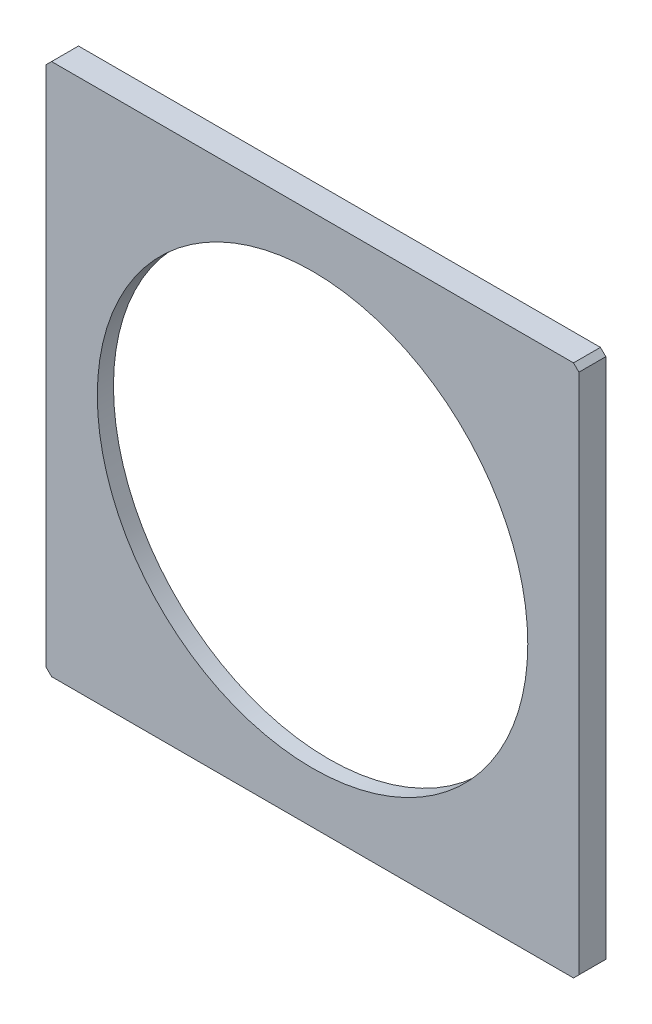
ISO-10303-21;
HEADER;
FILE_DESCRIPTION(('STEP AP214'),'2;1');
FILE_NAME('part.step','',(''),(''),'','','');
FILE_SCHEMA(('AUTOMOTIVE_DESIGN { 1 0 10303 214 1 1 1 1 }'));
ENDSEC;
DATA;
#1=APPLICATION_CONTEXT('core data for automotive mechanical design processes');
#2=APPLICATION_PROTOCOL_DEFINITION('international standard','automotive_design',2000,#1);
#3=PRODUCT_CONTEXT('',#1,'mechanical');
#4=PRODUCT('Part','Part','',(#3));
#5=PRODUCT_RELATED_PRODUCT_CATEGORY('part','',(#4));
#6=PRODUCT_DEFINITION_FORMATION('','',#4);
#7=PRODUCT_DEFINITION_CONTEXT('part definition',#1,'design');
#8=PRODUCT_DEFINITION('design','',#6,#7);
#9=PRODUCT_DEFINITION_SHAPE('','',#8);
#10=(LENGTH_UNIT() NAMED_UNIT(*) SI_UNIT(.MILLI.,.METRE.));
#11=(NAMED_UNIT(*) PLANE_ANGLE_UNIT() SI_UNIT($,.RADIAN.));
#12=(NAMED_UNIT(*) SI_UNIT($,.STERADIAN.) SOLID_ANGLE_UNIT());
#13=UNCERTAINTY_MEASURE_WITH_UNIT(LENGTH_MEASURE(1.E-05),#10,'distance_accuracy_value','');
#14=(GEOMETRIC_REPRESENTATION_CONTEXT(3) GLOBAL_UNCERTAINTY_ASSIGNED_CONTEXT((#13)) GLOBAL_UNIT_ASSIGNED_CONTEXT((#10,
#11,#12)) REPRESENTATION_CONTEXT('',''));
#15=CARTESIAN_POINT('',(0.,0.,0.));
#16=DIRECTION('',(0.,0.,1.));
#17=DIRECTION('',(1.,0.,0.));
#18=AXIS2_PLACEMENT_3D('',#15,#16,#17);
#19=CARTESIAN_POINT('',(0.,0.,0.));
#20=DIRECTION('',(0.,0.,1.));
#21=DIRECTION('',(1.,0.,0.));
#22=AXIS2_PLACEMENT_3D('',#19,#20,#21);
#23=PLANE('',#22);
#24=DIRECTION('',(0.,-1.,0.));
#25=VECTOR('',#24,1.);
#26=CARTESIAN_POINT('',(-49.5,49.5,0.));
#27=LINE('',#26,#25);
#28=CARTESIAN_POINT('',(-49.5,48.5,0.));
#29=VERTEX_POINT('',#28);
#30=CARTESIAN_POINT('',(-49.5,-48.5,0.));
#31=VERTEX_POINT('',#30);
#32=EDGE_CURVE('E145',#29,#31,#27,.T.);
#33=ORIENTED_EDGE('',*,*,#32,.F.);
#34=DIRECTION('',(-0.707106781186552,-0.707106781186543,0.));
#35=VECTOR('',#34,1.);
#36=CARTESIAN_POINT('',(-49.5,48.5,0.));
#37=LINE('',#36,#35);
#38=CARTESIAN_POINT('',(-48.5,49.5,0.));
#39=VERTEX_POINT('',#38);
#40=EDGE_CURVE('E130',#29,#39,#37,.F.);
#41=ORIENTED_EDGE('',*,*,#40,.T.);
#42=DIRECTION('',(-1.,0.,0.));
#43=VECTOR('',#42,1.);
#44=CARTESIAN_POINT('',(49.5,49.5,0.));
#45=LINE('',#44,#43);
#46=CARTESIAN_POINT('',(48.5,49.5,0.));
#47=VERTEX_POINT('',#46);
#48=EDGE_CURVE('E154',#47,#39,#45,.T.);
#49=ORIENTED_EDGE('',*,*,#48,.F.);
#50=DIRECTION('',(-0.707106781186548,0.707106781186548,0.));
#51=VECTOR('',#50,1.);
#52=CARTESIAN_POINT('',(48.5,49.5,0.));
#53=LINE('',#52,#51);
#54=CARTESIAN_POINT('',(49.5,48.5,0.));
#55=VERTEX_POINT('',#54);
#56=EDGE_CURVE('E138',#47,#55,#53,.F.);
#57=ORIENTED_EDGE('',*,*,#56,.T.);
#58=DIRECTION('',(0.,1.,0.));
#59=VECTOR('',#58,1.);
#60=CARTESIAN_POINT('',(49.5,49.5,0.));
#61=LINE('',#60,#59);
#62=CARTESIAN_POINT('',(49.5,-48.5,0.));
#63=VERTEX_POINT('',#62);
#64=EDGE_CURVE('E162',#63,#55,#61,.T.);
#65=ORIENTED_EDGE('',*,*,#64,.F.);
#66=DIRECTION('',(0.707106781186552,0.707106781186543,0.));
#67=VECTOR('',#66,1.);
#68=CARTESIAN_POINT('',(49.5,-48.5,0.));
#69=LINE('',#68,#67);
#70=CARTESIAN_POINT('',(48.5,-49.5,0.));
#71=VERTEX_POINT('',#70);
#72=EDGE_CURVE('E255',#63,#71,#69,.F.);
#73=ORIENTED_EDGE('',*,*,#72,.T.);
#74=DIRECTION('',(1.,0.,0.));
#75=VECTOR('',#74,1.);
#76=CARTESIAN_POINT('',(49.5,-49.5,0.));
#77=LINE('',#76,#75);
#78=CARTESIAN_POINT('',(-48.5,-49.5,0.));
#79=VERTEX_POINT('',#78);
#80=EDGE_CURVE('E253',#79,#71,#77,.T.);
#81=ORIENTED_EDGE('',*,*,#80,.F.);
#82=DIRECTION('',(0.707106781186548,-0.707106781186548,0.));
#83=VECTOR('',#82,1.);
#84=CARTESIAN_POINT('',(-48.5,-49.5,0.));
#85=LINE('',#84,#83);
#86=EDGE_CURVE('E146',#79,#31,#85,.F.);
#87=ORIENTED_EDGE('',*,*,#86,.T.);
#88=EDGE_LOOP('',(#33,#41,#49,#57,#65,#73,#81,#87));
#89=FACE_BOUND('',#88,.T.);
#90=CARTESIAN_POINT('',(0.,0.,-1.2E-05));
#91=DIRECTION('',(0.,0.,-1.));
#92=DIRECTION('',(-1.,0.,0.));
#93=AXIS2_PLACEMENT_3D('',#90,#91,#92);
#94=CIRCLE('',#93,43.);
#95=CARTESIAN_POINT('',(-43.,0.,-1.2E-05));
#96=VERTEX_POINT('',#95);
#97=EDGE_CURVE('E175',#96,#96,#94,.T.);
#98=ORIENTED_EDGE('',*,*,#97,.F.);
#99=EDGE_LOOP('',(#98));
#100=FACE_BOUND('',#99,.T.);
#101=ADVANCED_FACE('F50',(#89,#100),#23,.F.);
#102=CARTESIAN_POINT('',(0.,0.,5.));
#103=DIRECTION('',(0.,0.,-1.));
#104=DIRECTION('',(-1.,0.,0.));
#105=AXIS2_PLACEMENT_3D('',#102,#103,#104);
#106=CYLINDRICAL_SURFACE('',#105,40.);
#107=CARTESIAN_POINT('',(0.,0.,5.));
#108=DIRECTION('',(0.,0.,1.));
#109=DIRECTION('',(1.,0.,0.));
#110=AXIS2_PLACEMENT_3D('',#107,#108,#109);
#111=CIRCLE('',#110,40.);
#112=CARTESIAN_POINT('',(40.,0.,5.));
#113=VERTEX_POINT('',#112);
#114=EDGE_CURVE('E171',#113,#113,#111,.T.);
#115=ORIENTED_EDGE('',*,*,#114,.T.);
#116=EDGE_LOOP('',(#115));
#117=FACE_BOUND('',#116,.T.);
#118=CARTESIAN_POINT('',(0.,0.,2.));
#119=DIRECTION('',(0.,0.,-1.));
#120=DIRECTION('',(-1.,0.,0.));
#121=AXIS2_PLACEMENT_3D('',#118,#119,#120);
#122=CIRCLE('',#121,40.);
#123=CARTESIAN_POINT('',(-40.,0.,2.));
#124=VERTEX_POINT('',#123);
#125=EDGE_CURVE('E170',#124,#124,#122,.T.);
#126=ORIENTED_EDGE('',*,*,#125,.T.);
#127=EDGE_LOOP('',(#126));
#128=FACE_BOUND('',#127,.T.);
#129=ADVANCED_FACE('F188',(#117,#128),#106,.F.);
#130=CARTESIAN_POINT('',(0.,0.,5.));
#131=DIRECTION('',(0.,0.,1.));
#132=DIRECTION('',(1.,0.,0.));
#133=AXIS2_PLACEMENT_3D('',#130,#131,#132);
#134=PLANE('',#133);
#135=DIRECTION('',(-1.,0.,0.));
#136=VECTOR('',#135,1.);
#137=CARTESIAN_POINT('',(49.5,49.5,5.));
#138=LINE('',#137,#136);
#139=CARTESIAN_POINT('',(48.5,49.5,5.));
#140=VERTEX_POINT('',#139);
#141=CARTESIAN_POINT('',(-48.5,49.5,5.));
#142=VERTEX_POINT('',#141);
#143=EDGE_CURVE('E263',#140,#142,#138,.T.);
#144=ORIENTED_EDGE('',*,*,#143,.T.);
#145=DIRECTION('',(0.707106781186552,0.707106781186543,0.));
#146=VECTOR('',#145,1.);
#147=CARTESIAN_POINT('',(-48.9999999999997,49.0000000000003,5.));
#148=LINE('',#147,#146);
#149=CARTESIAN_POINT('',(-49.5,48.5,5.));
#150=VERTEX_POINT('',#149);
#151=EDGE_CURVE('E236',#142,#150,#148,.F.);
#152=ORIENTED_EDGE('',*,*,#151,.T.);
#153=DIRECTION('',(0.,-1.,0.));
#154=VECTOR('',#153,1.);
#155=CARTESIAN_POINT('',(-49.5,49.5,5.));
#156=LINE('',#155,#154);
#157=CARTESIAN_POINT('',(-49.5,-48.5,5.));
#158=VERTEX_POINT('',#157);
#159=EDGE_CURVE('E150',#150,#158,#156,.T.);
#160=ORIENTED_EDGE('',*,*,#159,.T.);
#161=DIRECTION('',(-0.707106781186548,0.707106781186548,0.));
#162=VECTOR('',#161,1.);
#163=CARTESIAN_POINT('',(-49.,-49.,5.));
#164=LINE('',#163,#162);
#165=CARTESIAN_POINT('',(-48.5,-49.5,5.));
#166=VERTEX_POINT('',#165);
#167=EDGE_CURVE('E234',#158,#166,#164,.F.);
#168=ORIENTED_EDGE('',*,*,#167,.T.);
#169=DIRECTION('',(1.,0.,0.));
#170=VECTOR('',#169,1.);
#171=CARTESIAN_POINT('',(49.5,-49.5,5.));
#172=LINE('',#171,#170);
#173=CARTESIAN_POINT('',(48.5,-49.5,5.));
#174=VERTEX_POINT('',#173);
#175=EDGE_CURVE('E152',#166,#174,#172,.T.);
#176=ORIENTED_EDGE('',*,*,#175,.T.);
#177=DIRECTION('',(-0.707106781186552,-0.707106781186543,0.));
#178=VECTOR('',#177,1.);
#179=CARTESIAN_POINT('',(48.9999999999996,-49.0000000000003,5.));
#180=LINE('',#179,#178);
#181=CARTESIAN_POINT('',(49.5,-48.5,5.));
#182=VERTEX_POINT('',#181);
#183=EDGE_CURVE('E76',#174,#182,#180,.F.);
#184=ORIENTED_EDGE('',*,*,#183,.T.);
#185=DIRECTION('',(0.,1.,0.));
#186=VECTOR('',#185,1.);
#187=CARTESIAN_POINT('',(49.5,49.5,5.));
#188=LINE('',#187,#186);
#189=CARTESIAN_POINT('',(49.5,48.5,5.));
#190=VERTEX_POINT('',#189);
#191=EDGE_CURVE('E159',#182,#190,#188,.T.);
#192=ORIENTED_EDGE('',*,*,#191,.T.);
#193=DIRECTION('',(0.707106781186548,-0.707106781186548,0.));
#194=VECTOR('',#193,1.);
#195=CARTESIAN_POINT('',(49.,49.,5.));
#196=LINE('',#195,#194);
#197=EDGE_CURVE('E233',#190,#140,#196,.F.);
#198=ORIENTED_EDGE('',*,*,#197,.T.);
#199=EDGE_LOOP('',(#144,#152,#160,#168,#176,#184,#192,#198));
#200=FACE_BOUND('',#199,.T.);
#201=ORIENTED_EDGE('',*,*,#114,.F.);
#202=EDGE_LOOP('',(#201));
#203=FACE_BOUND('',#202,.T.);
#204=ADVANCED_FACE('F189',(#200,#203),#134,.T.);
#205=CARTESIAN_POINT('',(49.5,-49.5,5.));
#206=DIRECTION('',(0.,1.,0.));
#207=DIRECTION('',(0.,0.,1.));
#208=AXIS2_PLACEMENT_3D('',#205,#206,#207);
#209=PLANE('',#208);
#210=ORIENTED_EDGE('',*,*,#80,.T.);
#211=DIRECTION('',(0.,0.,1.));
#212=VECTOR('',#211,1.);
#213=CARTESIAN_POINT('',(48.5,-49.5,5.));
#214=LINE('',#213,#212);
#215=EDGE_CURVE('E11',#71,#174,#214,.T.);
#216=ORIENTED_EDGE('',*,*,#215,.T.);
#217=ORIENTED_EDGE('',*,*,#175,.F.);
#218=DIRECTION('',(0.,0.,-1.));
#219=VECTOR('',#218,1.);
#220=CARTESIAN_POINT('',(-48.5,-49.5,5.));
#221=LINE('',#220,#219);
#222=EDGE_CURVE('E60',#166,#79,#221,.T.);
#223=ORIENTED_EDGE('',*,*,#222,.T.);
#224=EDGE_LOOP('',(#210,#216,#217,#223));
#225=FACE_BOUND('',#224,.T.);
#226=ADVANCED_FACE('F205',(#225),#209,.F.);
#227=CARTESIAN_POINT('',(49.5,49.5,5.));
#228=DIRECTION('',(-1.,0.,0.));
#229=DIRECTION('',(0.,-1.,0.));
#230=AXIS2_PLACEMENT_3D('',#227,#228,#229);
#231=PLANE('',#230);
#232=ORIENTED_EDGE('',*,*,#64,.T.);
#233=DIRECTION('',(0.,0.,1.));
#234=VECTOR('',#233,1.);
#235=CARTESIAN_POINT('',(49.5,48.5,5.));
#236=LINE('',#235,#234);
#237=EDGE_CURVE('E70',#55,#190,#236,.T.);
#238=ORIENTED_EDGE('',*,*,#237,.T.);
#239=ORIENTED_EDGE('',*,*,#191,.F.);
#240=DIRECTION('',(0.,0.,-1.));
#241=VECTOR('',#240,1.);
#242=CARTESIAN_POINT('',(49.5,-48.5,5.));
#243=LINE('',#242,#241);
#244=EDGE_CURVE('E232',#182,#63,#243,.T.);
#245=ORIENTED_EDGE('',*,*,#244,.T.);
#246=EDGE_LOOP('',(#232,#238,#239,#245));
#247=FACE_BOUND('',#246,.T.);
#248=ADVANCED_FACE('F196',(#247),#231,.F.);
#249=CARTESIAN_POINT('',(49.5,49.5,5.));
#250=DIRECTION('',(0.,-1.,0.));
#251=DIRECTION('',(0.,0.,-1.));
#252=AXIS2_PLACEMENT_3D('',#249,#250,#251);
#253=PLANE('',#252);
#254=ORIENTED_EDGE('',*,*,#48,.T.);
#255=DIRECTION('',(0.,0.,1.));
#256=VECTOR('',#255,1.);
#257=CARTESIAN_POINT('',(-48.5,49.5,5.));
#258=LINE('',#257,#256);
#259=EDGE_CURVE('E135',#39,#142,#258,.T.);
#260=ORIENTED_EDGE('',*,*,#259,.T.);
#261=ORIENTED_EDGE('',*,*,#143,.F.);
#262=DIRECTION('',(0.,0.,-1.));
#263=VECTOR('',#262,1.);
#264=CARTESIAN_POINT('',(48.5,49.5,5.));
#265=LINE('',#264,#263);
#266=EDGE_CURVE('E140',#140,#47,#265,.T.);
#267=ORIENTED_EDGE('',*,*,#266,.T.);
#268=EDGE_LOOP('',(#254,#260,#261,#267));
#269=FACE_BOUND('',#268,.T.);
#270=ADVANCED_FACE('F191',(#269),#253,.F.);
#271=CARTESIAN_POINT('',(-49.5,49.5,5.));
#272=DIRECTION('',(1.,0.,0.));
#273=DIRECTION('',(0.,1.,0.));
#274=AXIS2_PLACEMENT_3D('',#271,#272,#273);
#275=PLANE('',#274);
#276=ORIENTED_EDGE('',*,*,#159,.F.);
#277=DIRECTION('',(0.,0.,-1.));
#278=VECTOR('',#277,1.);
#279=CARTESIAN_POINT('',(-49.5,48.5,5.));
#280=LINE('',#279,#278);
#281=EDGE_CURVE('E131',#150,#29,#280,.T.);
#282=ORIENTED_EDGE('',*,*,#281,.T.);
#283=ORIENTED_EDGE('',*,*,#32,.T.);
#284=DIRECTION('',(0.,0.,1.));
#285=VECTOR('',#284,1.);
#286=CARTESIAN_POINT('',(-49.5,-48.5,5.));
#287=LINE('',#286,#285);
#288=EDGE_CURVE('E149',#31,#158,#287,.T.);
#289=ORIENTED_EDGE('',*,*,#288,.T.);
#290=EDGE_LOOP('',(#276,#282,#283,#289));
#291=FACE_BOUND('',#290,.T.);
#292=ADVANCED_FACE('F141',(#291),#275,.F.);
#293=CARTESIAN_POINT('',(0.,0.,-1.2E-05));
#294=DIRECTION('',(0.,0.,1.));
#295=DIRECTION('',(1.,0.,0.));
#296=AXIS2_PLACEMENT_3D('',#293,#294,#295);
#297=CYLINDRICAL_SURFACE('',#296,43.);
#298=ORIENTED_EDGE('',*,*,#97,.T.);
#299=EDGE_LOOP('',(#298));
#300=FACE_BOUND('',#299,.T.);
#301=CARTESIAN_POINT('',(0.,0.,2.));
#302=DIRECTION('',(0.,0.,-1.));
#303=DIRECTION('',(-1.,0.,0.));
#304=AXIS2_PLACEMENT_3D('',#301,#302,#303);
#305=CIRCLE('',#304,43.);
#306=CARTESIAN_POINT('',(-43.,0.,2.));
#307=VERTEX_POINT('',#306);
#308=EDGE_CURVE('E293',#307,#307,#305,.T.);
#309=ORIENTED_EDGE('',*,*,#308,.F.);
#310=EDGE_LOOP('',(#309));
#311=FACE_BOUND('',#310,.T.);
#312=ADVANCED_FACE('F194',(#300,#311),#297,.F.);
#313=CARTESIAN_POINT('',(0.,0.,2.));
#314=DIRECTION('',(0.,0.,-1.));
#315=DIRECTION('',(-1.,0.,0.));
#316=AXIS2_PLACEMENT_3D('',#313,#314,#315);
#317=PLANE('',#316);
#318=ORIENTED_EDGE('',*,*,#125,.F.);
#319=EDGE_LOOP('',(#318));
#320=FACE_BOUND('',#319,.T.);
#321=ORIENTED_EDGE('',*,*,#308,.T.);
#322=EDGE_LOOP('',(#321));
#323=FACE_BOUND('',#322,.T.);
#324=ADVANCED_FACE('F213',(#320,#323),#317,.T.);
#325=CARTESIAN_POINT('',(-49.5,48.5,5.));
#326=DIRECTION('',(0.707106781186543,-0.707106781186552,0.));
#327=DIRECTION('',(0.,0.,-1.));
#328=AXIS2_PLACEMENT_3D('',#325,#326,#327);
#329=PLANE('',#328);
#330=ORIENTED_EDGE('',*,*,#151,.F.);
#331=ORIENTED_EDGE('',*,*,#259,.F.);
#332=ORIENTED_EDGE('',*,*,#40,.F.);
#333=ORIENTED_EDGE('',*,*,#281,.F.);
#334=EDGE_LOOP('',(#330,#331,#332,#333));
#335=FACE_BOUND('',#334,.T.);
#336=ADVANCED_FACE('F128',(#335),#329,.F.);
#337=CARTESIAN_POINT('',(48.5,49.5,5.));
#338=DIRECTION('',(-0.707106781186547,-0.707106781186547,0.));
#339=DIRECTION('',(0.,0.,-1.));
#340=AXIS2_PLACEMENT_3D('',#337,#338,#339);
#341=PLANE('',#340);
#342=ORIENTED_EDGE('',*,*,#197,.F.);
#343=ORIENTED_EDGE('',*,*,#237,.F.);
#344=ORIENTED_EDGE('',*,*,#56,.F.);
#345=ORIENTED_EDGE('',*,*,#266,.F.);
#346=EDGE_LOOP('',(#342,#343,#344,#345));
#347=FACE_BOUND('',#346,.T.);
#348=ADVANCED_FACE('F215',(#347),#341,.F.);
#349=CARTESIAN_POINT('',(49.5,-48.5,5.));
#350=DIRECTION('',(-0.707106781186543,0.707106781186552,0.));
#351=DIRECTION('',(0.,0.,-1.));
#352=AXIS2_PLACEMENT_3D('',#349,#350,#351);
#353=PLANE('',#352);
#354=ORIENTED_EDGE('',*,*,#183,.F.);
#355=ORIENTED_EDGE('',*,*,#215,.F.);
#356=ORIENTED_EDGE('',*,*,#72,.F.);
#357=ORIENTED_EDGE('',*,*,#244,.F.);
#358=EDGE_LOOP('',(#354,#355,#356,#357));
#359=FACE_BOUND('',#358,.T.);
#360=ADVANCED_FACE('F217',(#359),#353,.F.);
#361=CARTESIAN_POINT('',(-48.5,-49.5,5.));
#362=DIRECTION('',(0.707106781186548,0.707106781186548,0.));
#363=DIRECTION('',(0.,0.,-1.));
#364=AXIS2_PLACEMENT_3D('',#361,#362,#363);
#365=PLANE('',#364);
#366=ORIENTED_EDGE('',*,*,#167,.F.);
#367=ORIENTED_EDGE('',*,*,#288,.F.);
#368=ORIENTED_EDGE('',*,*,#86,.F.);
#369=ORIENTED_EDGE('',*,*,#222,.F.);
#370=EDGE_LOOP('',(#366,#367,#368,#369));
#371=FACE_BOUND('',#370,.T.);
#372=ADVANCED_FACE('F49',(#371),#365,.F.);
#373=CLOSED_SHELL('',(#101,#129,#204,#226,#248,#270,#292,#312,#324,#336,#348,#360,#372));
#374=MANIFOLD_SOLID_BREP('B2',#373);
#375=ADVANCED_BREP_SHAPE_REPRESENTATION('',(#18,#374),#14);
#376=SHAPE_DEFINITION_REPRESENTATION(#9,#375);
ENDSEC;
END-ISO-10303-21;
